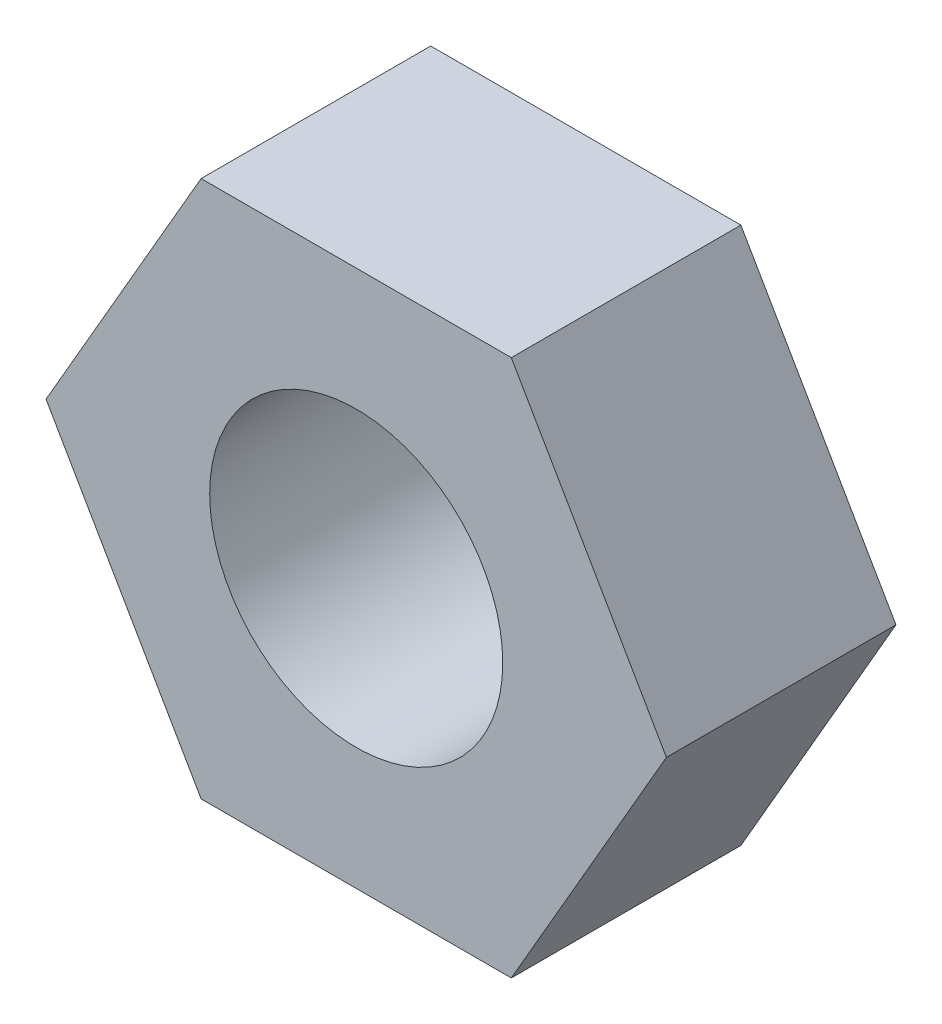
ISO-10303-21;
HEADER;
FILE_DESCRIPTION(('STEP AP214'),'2;1');
FILE_NAME('part.step','',(''),(''),'','','');
FILE_SCHEMA(('AUTOMOTIVE_DESIGN { 1 0 10303 214 1 1 1 1 }'));
ENDSEC;
DATA;
#1=APPLICATION_CONTEXT('core data for automotive mechanical design processes');
#2=APPLICATION_PROTOCOL_DEFINITION('international standard','automotive_design',2000,#1);
#3=PRODUCT_CONTEXT('',#1,'mechanical');
#4=PRODUCT('Part','Part','',(#3));
#5=PRODUCT_RELATED_PRODUCT_CATEGORY('part','',(#4));
#6=PRODUCT_DEFINITION_FORMATION('','',#4);
#7=PRODUCT_DEFINITION_CONTEXT('part definition',#1,'design');
#8=PRODUCT_DEFINITION('design','',#6,#7);
#9=PRODUCT_DEFINITION_SHAPE('','',#8);
#10=(LENGTH_UNIT() NAMED_UNIT(*) SI_UNIT(.MILLI.,.METRE.));
#11=(NAMED_UNIT(*) PLANE_ANGLE_UNIT() SI_UNIT($,.RADIAN.));
#12=(NAMED_UNIT(*) SI_UNIT($,.STERADIAN.) SOLID_ANGLE_UNIT());
#13=UNCERTAINTY_MEASURE_WITH_UNIT(LENGTH_MEASURE(1.E-05),#10,'distance_accuracy_value','');
#14=(GEOMETRIC_REPRESENTATION_CONTEXT(3) GLOBAL_UNCERTAINTY_ASSIGNED_CONTEXT((#13)) GLOBAL_UNIT_ASSIGNED_CONTEXT((#10,
#11,#12)) REPRESENTATION_CONTEXT('',''));
#15=CARTESIAN_POINT('',(0.,0.,0.));
#16=DIRECTION('',(0.,0.,1.));
#17=DIRECTION('',(1.,0.,0.));
#18=AXIS2_PLACEMENT_3D('',#15,#16,#17);
#19=CARTESIAN_POINT('',(3.17542648054294,-5.5,4.7));
#20=DIRECTION('',(0.,0.,-1.));
#21=DIRECTION('',(-1.,0.,0.));
#22=AXIS2_PLACEMENT_3D('',#19,#20,#21);
#23=PLANE('',#22);
#24=DIRECTION('',(0.5,0.866025403784439,0.));
#25=VECTOR('',#24,1.);
#26=CARTESIAN_POINT('',(3.17542648054295,-5.5,4.7));
#27=LINE('',#26,#25);
#28=CARTESIAN_POINT('',(3.17542648054295,-5.5,4.7));
#29=VERTEX_POINT('',#28);
#30=CARTESIAN_POINT('',(6.35085296108589,0.,4.7));
#31=VERTEX_POINT('',#30);
#32=EDGE_CURVE('E126',#29,#31,#27,.T.);
#33=ORIENTED_EDGE('',*,*,#32,.T.);
#34=DIRECTION('',(-0.5,0.866025403784439,0.));
#35=VECTOR('',#34,1.);
#36=CARTESIAN_POINT('',(6.35085296108589,0.,4.7));
#37=LINE('',#36,#35);
#38=CARTESIAN_POINT('',(3.17542648054294,5.5,4.7));
#39=VERTEX_POINT('',#38);
#40=EDGE_CURVE('E71',#31,#39,#37,.T.);
#41=ORIENTED_EDGE('',*,*,#40,.T.);
#42=DIRECTION('',(-1.,0.,0.));
#43=VECTOR('',#42,1.);
#44=CARTESIAN_POINT('',(3.17542648054294,5.5,4.7));
#45=LINE('',#44,#43);
#46=CARTESIAN_POINT('',(-3.17542648054295,5.5,4.7));
#47=VERTEX_POINT('',#46);
#48=EDGE_CURVE('E84',#39,#47,#45,.T.);
#49=ORIENTED_EDGE('',*,*,#48,.T.);
#50=DIRECTION('',(-0.5,-0.866025403784439,0.));
#51=VECTOR('',#50,1.);
#52=CARTESIAN_POINT('',(-3.17542648054295,5.5,4.7));
#53=LINE('',#52,#51);
#54=CARTESIAN_POINT('',(-6.35085296108589,0.,4.7));
#55=VERTEX_POINT('',#54);
#56=EDGE_CURVE('E78',#47,#55,#53,.T.);
#57=ORIENTED_EDGE('',*,*,#56,.T.);
#58=DIRECTION('',(0.5,-0.866025403784439,0.));
#59=VECTOR('',#58,1.);
#60=CARTESIAN_POINT('',(-6.35085296108589,0.,4.7));
#61=LINE('',#60,#59);
#62=CARTESIAN_POINT('',(-3.17542648054295,-5.5,4.7));
#63=VERTEX_POINT('',#62);
#64=EDGE_CURVE('E82',#55,#63,#61,.T.);
#65=ORIENTED_EDGE('',*,*,#64,.T.);
#66=DIRECTION('',(1.,0.,0.));
#67=VECTOR('',#66,1.);
#68=CARTESIAN_POINT('',(-3.17542648054295,-5.5,4.7));
#69=LINE('',#68,#67);
#70=EDGE_CURVE('E34',#63,#29,#69,.T.);
#71=ORIENTED_EDGE('',*,*,#70,.T.);
#72=EDGE_LOOP('',(#33,#41,#49,#57,#65,#71));
#73=FACE_BOUND('',#72,.T.);
#74=CARTESIAN_POINT('',(0.,0.,4.7));
#75=DIRECTION('',(0.,0.,1.));
#76=DIRECTION('',(1.,0.,0.));
#77=AXIS2_PLACEMENT_3D('',#74,#75,#76);
#78=CIRCLE('',#77,3.);
#79=CARTESIAN_POINT('',(3.,0.,4.7));
#80=VERTEX_POINT('',#79);
#81=EDGE_CURVE('E114',#80,#80,#78,.T.);
#82=ORIENTED_EDGE('',*,*,#81,.F.);
#83=EDGE_LOOP('',(#82));
#84=FACE_BOUND('',#83,.T.);
#85=ADVANCED_FACE('F16',(#73,#84),#23,.F.);
#86=CARTESIAN_POINT('',(3.17542648054294,-5.5,0.));
#87=DIRECTION('',(0.,0.,-1.));
#88=DIRECTION('',(-1.,0.,0.));
#89=AXIS2_PLACEMENT_3D('',#86,#87,#88);
#90=PLANE('',#89);
#91=DIRECTION('',(0.5,0.866025403784439,0.));
#92=VECTOR('',#91,1.);
#93=CARTESIAN_POINT('',(3.17542648054295,-5.5,0.));
#94=LINE('',#93,#92);
#95=CARTESIAN_POINT('',(3.17542648054295,-5.5,0.));
#96=VERTEX_POINT('',#95);
#97=CARTESIAN_POINT('',(6.35085296108589,0.,0.));
#98=VERTEX_POINT('',#97);
#99=EDGE_CURVE('E109',#96,#98,#94,.T.);
#100=ORIENTED_EDGE('',*,*,#99,.F.);
#101=DIRECTION('',(1.,0.,0.));
#102=VECTOR('',#101,1.);
#103=CARTESIAN_POINT('',(-3.17542648054295,-5.5,0.));
#104=LINE('',#103,#102);
#105=CARTESIAN_POINT('',(-3.17542648054295,-5.5,0.));
#106=VERTEX_POINT('',#105);
#107=EDGE_CURVE('E63',#106,#96,#104,.T.);
#108=ORIENTED_EDGE('',*,*,#107,.F.);
#109=DIRECTION('',(0.5,-0.866025403784439,0.));
#110=VECTOR('',#109,1.);
#111=CARTESIAN_POINT('',(-6.35085296108589,0.,0.));
#112=LINE('',#111,#110);
#113=CARTESIAN_POINT('',(-6.35085296108589,0.,0.));
#114=VERTEX_POINT('',#113);
#115=EDGE_CURVE('E57',#114,#106,#112,.T.);
#116=ORIENTED_EDGE('',*,*,#115,.F.);
#117=DIRECTION('',(-0.5,-0.866025403784439,0.));
#118=VECTOR('',#117,1.);
#119=CARTESIAN_POINT('',(-3.17542648054295,5.5,0.));
#120=LINE('',#119,#118);
#121=CARTESIAN_POINT('',(-3.17542648054295,5.5,0.));
#122=VERTEX_POINT('',#121);
#123=EDGE_CURVE('E93',#122,#114,#120,.T.);
#124=ORIENTED_EDGE('',*,*,#123,.F.);
#125=DIRECTION('',(-1.,0.,0.));
#126=VECTOR('',#125,1.);
#127=CARTESIAN_POINT('',(3.17542648054294,5.5,0.));
#128=LINE('',#127,#126);
#129=CARTESIAN_POINT('',(3.17542648054294,5.5,0.));
#130=VERTEX_POINT('',#129);
#131=EDGE_CURVE('E117',#130,#122,#128,.T.);
#132=ORIENTED_EDGE('',*,*,#131,.F.);
#133=DIRECTION('',(-0.5,0.866025403784439,0.));
#134=VECTOR('',#133,1.);
#135=CARTESIAN_POINT('',(6.35085296108589,0.,0.));
#136=LINE('',#135,#134);
#137=EDGE_CURVE('E113',#98,#130,#136,.T.);
#138=ORIENTED_EDGE('',*,*,#137,.F.);
#139=EDGE_LOOP('',(#100,#108,#116,#124,#132,#138));
#140=FACE_BOUND('',#139,.T.);
#141=CARTESIAN_POINT('',(0.,0.,0.));
#142=DIRECTION('',(0.,0.,1.));
#143=DIRECTION('',(1.,0.,0.));
#144=AXIS2_PLACEMENT_3D('',#141,#142,#143);
#145=CIRCLE('',#144,3.);
#146=CARTESIAN_POINT('',(3.,0.,0.));
#147=VERTEX_POINT('',#146);
#148=EDGE_CURVE('E258',#147,#147,#145,.T.);
#149=ORIENTED_EDGE('',*,*,#148,.T.);
#150=EDGE_LOOP('',(#149));
#151=FACE_BOUND('',#150,.T.);
#152=ADVANCED_FACE('F141',(#140,#151),#90,.T.);
#153=CARTESIAN_POINT('',(3.17542648054295,-5.5,4.7));
#154=DIRECTION('',(-0.866025403784439,0.5,0.));
#155=DIRECTION('',(-0.5,-0.866025403784439,0.));
#156=AXIS2_PLACEMENT_3D('',#153,#154,#155);
#157=PLANE('',#156);
#158=ORIENTED_EDGE('',*,*,#99,.T.);
#159=DIRECTION('',(0.,0.,-1.));
#160=VECTOR('',#159,1.);
#161=CARTESIAN_POINT('',(6.35085296108589,0.,4.7));
#162=LINE('',#161,#160);
#163=EDGE_CURVE('E11',#31,#98,#162,.T.);
#164=ORIENTED_EDGE('',*,*,#163,.F.);
#165=ORIENTED_EDGE('',*,*,#32,.F.);
#166=DIRECTION('',(0.,0.,-1.));
#167=VECTOR('',#166,1.);
#168=CARTESIAN_POINT('',(3.17542648054295,-5.5,4.7));
#169=LINE('',#168,#167);
#170=EDGE_CURVE('E105',#29,#96,#169,.T.);
#171=ORIENTED_EDGE('',*,*,#170,.T.);
#172=EDGE_LOOP('',(#158,#164,#165,#171));
#173=FACE_BOUND('',#172,.T.);
#174=ADVANCED_FACE('F18',(#173),#157,.F.);
#175=CARTESIAN_POINT('',(6.35085296108589,0.,4.7));
#176=DIRECTION('',(-0.866025403784439,-0.5,0.));
#177=DIRECTION('',(0.5,-0.866025403784439,0.));
#178=AXIS2_PLACEMENT_3D('',#175,#176,#177);
#179=PLANE('',#178);
#180=ORIENTED_EDGE('',*,*,#137,.T.);
#181=DIRECTION('',(0.,0.,-1.));
#182=VECTOR('',#181,1.);
#183=CARTESIAN_POINT('',(3.17542648054294,5.5,4.7));
#184=LINE('',#183,#182);
#185=EDGE_CURVE('E26',#39,#130,#184,.T.);
#186=ORIENTED_EDGE('',*,*,#185,.F.);
#187=ORIENTED_EDGE('',*,*,#40,.F.);
#188=ORIENTED_EDGE('',*,*,#163,.T.);
#189=EDGE_LOOP('',(#180,#186,#187,#188));
#190=FACE_BOUND('',#189,.T.);
#191=ADVANCED_FACE('F170',(#190),#179,.F.);
#192=CARTESIAN_POINT('',(3.17542648054294,5.5,4.7));
#193=DIRECTION('',(0.,-1.,0.));
#194=DIRECTION('',(1.,0.,0.));
#195=AXIS2_PLACEMENT_3D('',#192,#193,#194);
#196=PLANE('',#195);
#197=ORIENTED_EDGE('',*,*,#131,.T.);
#198=DIRECTION('',(0.,0.,-1.));
#199=VECTOR('',#198,1.);
#200=CARTESIAN_POINT('',(-3.17542648054295,5.5,4.7));
#201=LINE('',#200,#199);
#202=EDGE_CURVE('E95',#47,#122,#201,.T.);
#203=ORIENTED_EDGE('',*,*,#202,.F.);
#204=ORIENTED_EDGE('',*,*,#48,.F.);
#205=ORIENTED_EDGE('',*,*,#185,.T.);
#206=EDGE_LOOP('',(#197,#203,#204,#205));
#207=FACE_BOUND('',#206,.T.);
#208=ADVANCED_FACE('F138',(#207),#196,.F.);
#209=CARTESIAN_POINT('',(-3.17542648054295,5.5,4.7));
#210=DIRECTION('',(0.866025403784439,-0.5,0.));
#211=DIRECTION('',(0.5,0.866025403784439,0.));
#212=AXIS2_PLACEMENT_3D('',#209,#210,#211);
#213=PLANE('',#212);
#214=ORIENTED_EDGE('',*,*,#123,.T.);
#215=DIRECTION('',(0.,0.,-1.));
#216=VECTOR('',#215,1.);
#217=CARTESIAN_POINT('',(-6.35085296108589,0.,4.7));
#218=LINE('',#217,#216);
#219=EDGE_CURVE('E90',#55,#114,#218,.T.);
#220=ORIENTED_EDGE('',*,*,#219,.F.);
#221=ORIENTED_EDGE('',*,*,#56,.F.);
#222=ORIENTED_EDGE('',*,*,#202,.T.);
#223=EDGE_LOOP('',(#214,#220,#221,#222));
#224=FACE_BOUND('',#223,.T.);
#225=ADVANCED_FACE('F91',(#224),#213,.F.);
#226=CARTESIAN_POINT('',(-6.35085296108589,0.,4.7));
#227=DIRECTION('',(0.866025403784439,0.5,0.));
#228=DIRECTION('',(-0.5,0.866025403784439,0.));
#229=AXIS2_PLACEMENT_3D('',#226,#227,#228);
#230=PLANE('',#229);
#231=ORIENTED_EDGE('',*,*,#115,.T.);
#232=DIRECTION('',(0.,0.,-1.));
#233=VECTOR('',#232,1.);
#234=CARTESIAN_POINT('',(-3.17542648054295,-5.5,4.7));
#235=LINE('',#234,#233);
#236=EDGE_CURVE('E96',#63,#106,#235,.T.);
#237=ORIENTED_EDGE('',*,*,#236,.F.);
#238=ORIENTED_EDGE('',*,*,#64,.F.);
#239=ORIENTED_EDGE('',*,*,#219,.T.);
#240=EDGE_LOOP('',(#231,#237,#238,#239));
#241=FACE_BOUND('',#240,.T.);
#242=ADVANCED_FACE('F98',(#241),#230,.F.);
#243=CARTESIAN_POINT('',(-3.17542648054295,-5.5,4.7));
#244=DIRECTION('',(0.,1.,0.));
#245=DIRECTION('',(0.,0.,1.));
#246=AXIS2_PLACEMENT_3D('',#243,#244,#245);
#247=PLANE('',#246);
#248=ORIENTED_EDGE('',*,*,#107,.T.);
#249=ORIENTED_EDGE('',*,*,#170,.F.);
#250=ORIENTED_EDGE('',*,*,#70,.F.);
#251=ORIENTED_EDGE('',*,*,#236,.T.);
#252=EDGE_LOOP('',(#248,#249,#250,#251));
#253=FACE_BOUND('',#252,.T.);
#254=ADVANCED_FACE('F146',(#253),#247,.F.);
#255=CARTESIAN_POINT('',(0.,0.,4.7));
#256=DIRECTION('',(0.,0.,-1.));
#257=DIRECTION('',(-1.,0.,0.));
#258=AXIS2_PLACEMENT_3D('',#255,#256,#257);
#259=CYLINDRICAL_SURFACE('',#258,3.);
#260=ORIENTED_EDGE('',*,*,#81,.T.);
#261=EDGE_LOOP('',(#260));
#262=FACE_BOUND('',#261,.T.);
#263=ORIENTED_EDGE('',*,*,#148,.F.);
#264=EDGE_LOOP('',(#263));
#265=FACE_BOUND('',#264,.T.);
#266=ADVANCED_FACE('F148',(#262,#265),#259,.F.);
#267=CLOSED_SHELL('',(#85,#152,#174,#191,#208,#225,#242,#254,#266));
#268=MANIFOLD_SOLID_BREP('B1',#267);
#269=ADVANCED_BREP_SHAPE_REPRESENTATION('',(#18,#268),#14);
#270=SHAPE_DEFINITION_REPRESENTATION(#9,#269);
ENDSEC;
END-ISO-10303-21;
